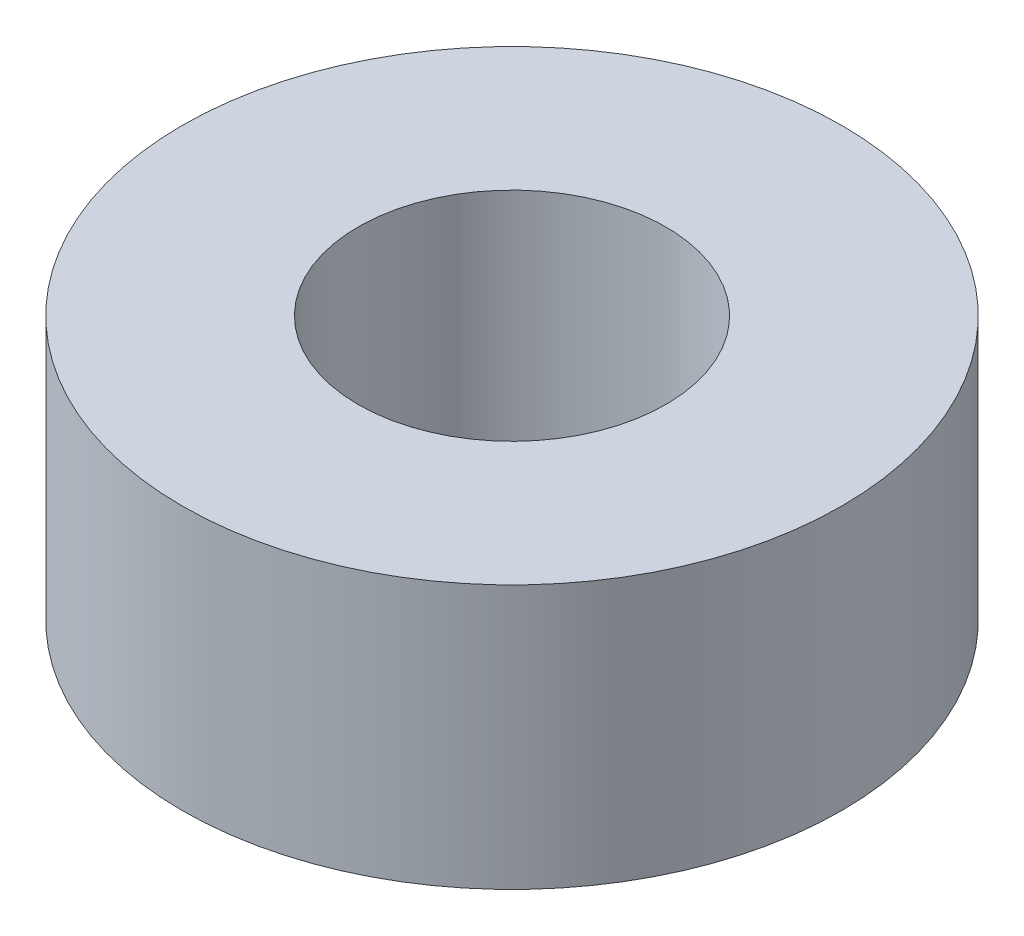
ISO-10303-21;
HEADER;
FILE_DESCRIPTION(('STEP AP214'),'2;1');
FILE_NAME('part.step','',(''),(''),'','','');
FILE_SCHEMA(('AUTOMOTIVE_DESIGN { 1 0 10303 214 1 1 1 1 }'));
ENDSEC;
DATA;
#1=APPLICATION_CONTEXT('core data for automotive mechanical design processes');
#2=APPLICATION_PROTOCOL_DEFINITION('international standard','automotive_design',2000,#1);
#3=PRODUCT_CONTEXT('',#1,'mechanical');
#4=PRODUCT('Part','Part','',(#3));
#5=PRODUCT_RELATED_PRODUCT_CATEGORY('part','',(#4));
#6=PRODUCT_DEFINITION_FORMATION('','',#4);
#7=PRODUCT_DEFINITION_CONTEXT('part definition',#1,'design');
#8=PRODUCT_DEFINITION('design','',#6,#7);
#9=PRODUCT_DEFINITION_SHAPE('','',#8);
#10=(LENGTH_UNIT() NAMED_UNIT(*) SI_UNIT(.MILLI.,.METRE.));
#11=(NAMED_UNIT(*) PLANE_ANGLE_UNIT() SI_UNIT($,.RADIAN.));
#12=(NAMED_UNIT(*) SI_UNIT($,.STERADIAN.) SOLID_ANGLE_UNIT());
#13=UNCERTAINTY_MEASURE_WITH_UNIT(LENGTH_MEASURE(1.E-05),#10,'distance_accuracy_value','');
#14=(GEOMETRIC_REPRESENTATION_CONTEXT(3) GLOBAL_UNCERTAINTY_ASSIGNED_CONTEXT((#13)) GLOBAL_UNIT_ASSIGNED_CONTEXT((#10,
#11,#12)) REPRESENTATION_CONTEXT('',''));
#15=CARTESIAN_POINT('',(0.,0.,0.));
#16=DIRECTION('',(0.,0.,1.));
#17=DIRECTION('',(1.,0.,0.));
#18=AXIS2_PLACEMENT_3D('',#15,#16,#17);
#19=CARTESIAN_POINT('',(0.,3.,0.));
#20=DIRECTION('',(0.,1.,0.));
#21=DIRECTION('',(0.,0.,1.));
#22=AXIS2_PLACEMENT_3D('',#19,#20,#21);
#23=PLANE('',#22);
#24=CARTESIAN_POINT('',(0.,3.,0.));
#25=DIRECTION('',(0.,1.,0.));
#26=DIRECTION('',(0.,0.,1.));
#27=AXIS2_PLACEMENT_3D('',#24,#25,#26);
#28=CIRCLE('',#27,3.75);
#29=CARTESIAN_POINT('',(0.,3.,3.75));
#30=VERTEX_POINT('',#29);
#31=EDGE_CURVE('E10',#30,#30,#28,.T.);
#32=ORIENTED_EDGE('',*,*,#31,.T.);
#33=EDGE_LOOP('',(#32));
#34=FACE_BOUND('',#33,.T.);
#35=CARTESIAN_POINT('',(0.,3.,0.));
#36=DIRECTION('',(0.,1.,0.));
#37=DIRECTION('',(0.,0.,1.));
#38=AXIS2_PLACEMENT_3D('',#35,#36,#37);
#39=CIRCLE('',#38,1.75);
#40=CARTESIAN_POINT('',(0.,3.,1.75));
#41=VERTEX_POINT('',#40);
#42=EDGE_CURVE('E43',#41,#41,#39,.T.);
#43=ORIENTED_EDGE('',*,*,#42,.F.);
#44=EDGE_LOOP('',(#43));
#45=FACE_BOUND('',#44,.T.);
#46=ADVANCED_FACE('F32',(#34,#45),#23,.T.);
#47=CARTESIAN_POINT('',(0.,0.,0.));
#48=DIRECTION('',(0.,1.,0.));
#49=DIRECTION('',(0.,0.,1.));
#50=AXIS2_PLACEMENT_3D('',#47,#48,#49);
#51=PLANE('',#50);
#52=CARTESIAN_POINT('',(0.,0.,0.));
#53=DIRECTION('',(0.,1.,0.));
#54=DIRECTION('',(0.,0.,1.));
#55=AXIS2_PLACEMENT_3D('',#52,#53,#54);
#56=CIRCLE('',#55,3.75);
#57=CARTESIAN_POINT('',(0.,0.,3.75));
#58=VERTEX_POINT('',#57);
#59=EDGE_CURVE('E36',#58,#58,#56,.T.);
#60=ORIENTED_EDGE('',*,*,#59,.F.);
#61=EDGE_LOOP('',(#60));
#62=FACE_BOUND('',#61,.T.);
#63=CARTESIAN_POINT('',(0.,0.,0.));
#64=DIRECTION('',(0.,1.,0.));
#65=DIRECTION('',(0.,0.,1.));
#66=AXIS2_PLACEMENT_3D('',#63,#64,#65);
#67=CIRCLE('',#66,1.75);
#68=CARTESIAN_POINT('',(0.,0.,1.75));
#69=VERTEX_POINT('',#68);
#70=EDGE_CURVE('E45',#69,#69,#67,.T.);
#71=ORIENTED_EDGE('',*,*,#70,.T.);
#72=EDGE_LOOP('',(#71));
#73=FACE_BOUND('',#72,.T.);
#74=ADVANCED_FACE('F55',(#62,#73),#51,.F.);
#75=CARTESIAN_POINT('',(0.,3.,0.));
#76=DIRECTION('',(0.,-1.,0.));
#77=DIRECTION('',(0.,0.,-1.));
#78=AXIS2_PLACEMENT_3D('',#75,#76,#77);
#79=CYLINDRICAL_SURFACE('',#78,3.75);
#80=ORIENTED_EDGE('',*,*,#31,.F.);
#81=EDGE_LOOP('',(#80));
#82=FACE_BOUND('',#81,.T.);
#83=ORIENTED_EDGE('',*,*,#59,.T.);
#84=EDGE_LOOP('',(#83));
#85=FACE_BOUND('',#84,.T.);
#86=ADVANCED_FACE('F34',(#82,#85),#79,.T.);
#87=CARTESIAN_POINT('',(0.,3.,0.));
#88=DIRECTION('',(0.,-1.,0.));
#89=DIRECTION('',(0.,0.,-1.));
#90=AXIS2_PLACEMENT_3D('',#87,#88,#89);
#91=CYLINDRICAL_SURFACE('',#90,1.75);
#92=ORIENTED_EDGE('',*,*,#42,.T.);
#93=EDGE_LOOP('',(#92));
#94=FACE_BOUND('',#93,.T.);
#95=ORIENTED_EDGE('',*,*,#70,.F.);
#96=EDGE_LOOP('',(#95));
#97=FACE_BOUND('',#96,.T.);
#98=ADVANCED_FACE('F51',(#94,#97),#91,.F.);
#99=CLOSED_SHELL('',(#46,#74,#86,#98));
#100=MANIFOLD_SOLID_BREP('B2',#99);
#101=ADVANCED_BREP_SHAPE_REPRESENTATION('',(#18,#100),#14);
#102=SHAPE_DEFINITION_REPRESENTATION(#9,#101);
ENDSEC;
END-ISO-10303-21;
